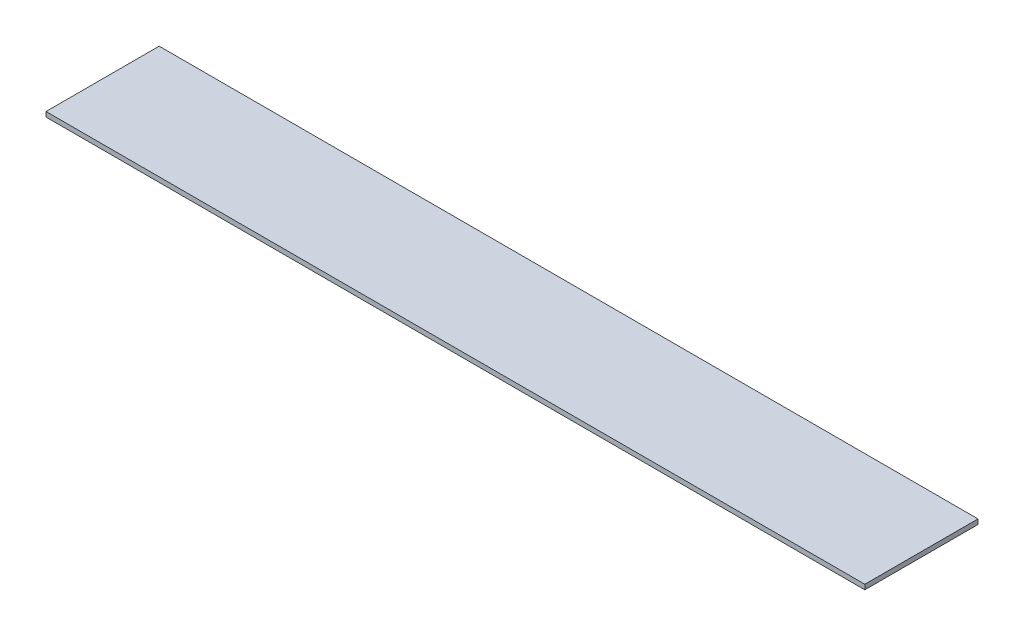
ISO-10303-21;
HEADER;
FILE_DESCRIPTION(('STEP AP214'),'2;1');
FILE_NAME('part.step','',(''),(''),'','','');
FILE_SCHEMA(('AUTOMOTIVE_DESIGN { 1 0 10303 214 1 1 1 1 }'));
ENDSEC;
DATA;
#1=APPLICATION_CONTEXT('core data for automotive mechanical design processes');
#2=APPLICATION_PROTOCOL_DEFINITION('international standard','automotive_design',2000,#1);
#3=PRODUCT_CONTEXT('',#1,'mechanical');
#4=PRODUCT('Part','Part','',(#3));
#5=PRODUCT_RELATED_PRODUCT_CATEGORY('part','',(#4));
#6=PRODUCT_DEFINITION_FORMATION('','',#4);
#7=PRODUCT_DEFINITION_CONTEXT('part definition',#1,'design');
#8=PRODUCT_DEFINITION('design','',#6,#7);
#9=PRODUCT_DEFINITION_SHAPE('','',#8);
#10=(LENGTH_UNIT() NAMED_UNIT(*) SI_UNIT(.MILLI.,.METRE.));
#11=(NAMED_UNIT(*) PLANE_ANGLE_UNIT() SI_UNIT($,.RADIAN.));
#12=(NAMED_UNIT(*) SI_UNIT($,.STERADIAN.) SOLID_ANGLE_UNIT());
#13=UNCERTAINTY_MEASURE_WITH_UNIT(LENGTH_MEASURE(1.E-05),#10,'distance_accuracy_value','');
#14=(GEOMETRIC_REPRESENTATION_CONTEXT(3) GLOBAL_UNCERTAINTY_ASSIGNED_CONTEXT((#13)) GLOBAL_UNIT_ASSIGNED_CONTEXT((#10,
#11,#12)) REPRESENTATION_CONTEXT('',''));
#15=CARTESIAN_POINT('',(0.,0.,0.));
#16=DIRECTION('',(0.,0.,1.));
#17=DIRECTION('',(1.,0.,0.));
#18=AXIS2_PLACEMENT_3D('',#15,#16,#17);
#19=CARTESIAN_POINT('',(-253.25,3.,35.));
#20=DIRECTION('',(1.,0.,0.));
#21=DIRECTION('',(0.,0.,-1.));
#22=AXIS2_PLACEMENT_3D('',#19,#20,#21);
#23=PLANE('',#22);
#24=DIRECTION('',(0.,0.,1.));
#25=VECTOR('',#24,1.);
#26=CARTESIAN_POINT('',(-253.25,0.,35.));
#27=LINE('',#26,#25);
#28=CARTESIAN_POINT('',(-253.25,0.,-35.));
#29=VERTEX_POINT('',#28);
#30=CARTESIAN_POINT('',(-253.25,0.,35.));
#31=VERTEX_POINT('',#30);
#32=EDGE_CURVE('E94',#29,#31,#27,.T.);
#33=ORIENTED_EDGE('',*,*,#32,.T.);
#34=DIRECTION('',(0.,-1.,0.));
#35=VECTOR('',#34,1.);
#36=CARTESIAN_POINT('',(-253.25,3.,35.));
#37=LINE('',#36,#35);
#38=CARTESIAN_POINT('',(-253.25,3.,35.));
#39=VERTEX_POINT('',#38);
#40=EDGE_CURVE('E11',#39,#31,#37,.T.);
#41=ORIENTED_EDGE('',*,*,#40,.F.);
#42=DIRECTION('',(0.,0.,1.));
#43=VECTOR('',#42,1.);
#44=CARTESIAN_POINT('',(-253.25,3.,35.));
#45=LINE('',#44,#43);
#46=CARTESIAN_POINT('',(-253.25,3.,-35.));
#47=VERTEX_POINT('',#46);
#48=EDGE_CURVE('E82',#47,#39,#45,.T.);
#49=ORIENTED_EDGE('',*,*,#48,.F.);
#50=DIRECTION('',(0.,-1.,0.));
#51=VECTOR('',#50,1.);
#52=CARTESIAN_POINT('',(-253.25,3.,-35.));
#53=LINE('',#52,#51);
#54=EDGE_CURVE('E90',#47,#29,#53,.T.);
#55=ORIENTED_EDGE('',*,*,#54,.T.);
#56=EDGE_LOOP('',(#33,#41,#49,#55));
#57=FACE_BOUND('',#56,.T.);
#58=ADVANCED_FACE('F31',(#57),#23,.F.);
#59=CARTESIAN_POINT('',(253.25,3.,35.));
#60=DIRECTION('',(0.,0.,-1.));
#61=DIRECTION('',(-1.,0.,0.));
#62=AXIS2_PLACEMENT_3D('',#59,#60,#61);
#63=PLANE('',#62);
#64=DIRECTION('',(1.,0.,0.));
#65=VECTOR('',#64,1.);
#66=CARTESIAN_POINT('',(253.25,0.,35.));
#67=LINE('',#66,#65);
#68=CARTESIAN_POINT('',(253.25,0.,35.));
#69=VERTEX_POINT('',#68);
#70=EDGE_CURVE('E86',#31,#69,#67,.T.);
#71=ORIENTED_EDGE('',*,*,#70,.T.);
#72=DIRECTION('',(0.,-1.,0.));
#73=VECTOR('',#72,1.);
#74=CARTESIAN_POINT('',(253.25,3.,35.));
#75=LINE('',#74,#73);
#76=CARTESIAN_POINT('',(253.25,3.,35.));
#77=VERTEX_POINT('',#76);
#78=EDGE_CURVE('E39',#77,#69,#75,.T.);
#79=ORIENTED_EDGE('',*,*,#78,.F.);
#80=DIRECTION('',(1.,0.,0.));
#81=VECTOR('',#80,1.);
#82=CARTESIAN_POINT('',(253.25,3.,35.));
#83=LINE('',#82,#81);
#84=EDGE_CURVE('E77',#39,#77,#83,.T.);
#85=ORIENTED_EDGE('',*,*,#84,.F.);
#86=ORIENTED_EDGE('',*,*,#40,.T.);
#87=EDGE_LOOP('',(#71,#79,#85,#86));
#88=FACE_BOUND('',#87,.T.);
#89=ADVANCED_FACE('F85',(#88),#63,.F.);
#90=CARTESIAN_POINT('',(253.25,3.,35.));
#91=DIRECTION('',(-1.,0.,0.));
#92=DIRECTION('',(0.,0.,1.));
#93=AXIS2_PLACEMENT_3D('',#90,#91,#92);
#94=PLANE('',#93);
#95=DIRECTION('',(0.,0.,-1.));
#96=VECTOR('',#95,1.);
#97=CARTESIAN_POINT('',(253.25,0.,35.));
#98=LINE('',#97,#96);
#99=CARTESIAN_POINT('',(253.25,0.,-35.));
#100=VERTEX_POINT('',#99);
#101=EDGE_CURVE('E64',#69,#100,#98,.T.);
#102=ORIENTED_EDGE('',*,*,#101,.T.);
#103=DIRECTION('',(0.,-1.,0.));
#104=VECTOR('',#103,1.);
#105=CARTESIAN_POINT('',(253.25,3.,-35.));
#106=LINE('',#105,#104);
#107=CARTESIAN_POINT('',(253.25,3.,-35.));
#108=VERTEX_POINT('',#107);
#109=EDGE_CURVE('E87',#108,#100,#106,.T.);
#110=ORIENTED_EDGE('',*,*,#109,.F.);
#111=DIRECTION('',(0.,0.,-1.));
#112=VECTOR('',#111,1.);
#113=CARTESIAN_POINT('',(253.25,3.,35.));
#114=LINE('',#113,#112);
#115=EDGE_CURVE('E80',#77,#108,#114,.T.);
#116=ORIENTED_EDGE('',*,*,#115,.F.);
#117=ORIENTED_EDGE('',*,*,#78,.T.);
#118=EDGE_LOOP('',(#102,#110,#116,#117));
#119=FACE_BOUND('',#118,.T.);
#120=ADVANCED_FACE('F88',(#119),#94,.F.);
#121=CARTESIAN_POINT('',(253.25,3.,-35.));
#122=DIRECTION('',(0.,0.,1.));
#123=DIRECTION('',(1.,0.,0.));
#124=AXIS2_PLACEMENT_3D('',#121,#122,#123);
#125=PLANE('',#124);
#126=DIRECTION('',(-1.,0.,0.));
#127=VECTOR('',#126,1.);
#128=CARTESIAN_POINT('',(253.25,0.,-35.));
#129=LINE('',#128,#127);
#130=EDGE_CURVE('E70',#100,#29,#129,.T.);
#131=ORIENTED_EDGE('',*,*,#130,.T.);
#132=ORIENTED_EDGE('',*,*,#54,.F.);
#133=DIRECTION('',(-1.,0.,0.));
#134=VECTOR('',#133,1.);
#135=CARTESIAN_POINT('',(253.25,3.,-35.));
#136=LINE('',#135,#134);
#137=EDGE_CURVE('E47',#108,#47,#136,.T.);
#138=ORIENTED_EDGE('',*,*,#137,.F.);
#139=ORIENTED_EDGE('',*,*,#109,.T.);
#140=EDGE_LOOP('',(#131,#132,#138,#139));
#141=FACE_BOUND('',#140,.T.);
#142=ADVANCED_FACE('F101',(#141),#125,.F.);
#143=CARTESIAN_POINT('',(-253.25,3.,-35.));
#144=DIRECTION('',(0.,1.,0.));
#145=DIRECTION('',(0.,0.,1.));
#146=AXIS2_PLACEMENT_3D('',#143,#144,#145);
#147=PLANE('',#146);
#148=ORIENTED_EDGE('',*,*,#48,.T.);
#149=ORIENTED_EDGE('',*,*,#84,.T.);
#150=ORIENTED_EDGE('',*,*,#115,.T.);
#151=ORIENTED_EDGE('',*,*,#137,.T.);
#152=EDGE_LOOP('',(#148,#149,#150,#151));
#153=FACE_BOUND('',#152,.T.);
#154=ADVANCED_FACE('F78',(#153),#147,.T.);
#155=CARTESIAN_POINT('',(-253.25,0.,-35.));
#156=DIRECTION('',(0.,1.,0.));
#157=DIRECTION('',(0.,0.,1.));
#158=AXIS2_PLACEMENT_3D('',#155,#156,#157);
#159=PLANE('',#158);
#160=ORIENTED_EDGE('',*,*,#32,.F.);
#161=ORIENTED_EDGE('',*,*,#130,.F.);
#162=ORIENTED_EDGE('',*,*,#101,.F.);
#163=ORIENTED_EDGE('',*,*,#70,.F.);
#164=EDGE_LOOP('',(#160,#161,#162,#163));
#165=FACE_BOUND('',#164,.T.);
#166=ADVANCED_FACE('F104',(#165),#159,.F.);
#167=CLOSED_SHELL('',(#58,#89,#120,#142,#154,#166));
#168=MANIFOLD_SOLID_BREP('B2',#167);
#169=ADVANCED_BREP_SHAPE_REPRESENTATION('',(#18,#168),#14);
#170=SHAPE_DEFINITION_REPRESENTATION(#9,#169);
ENDSEC;
END-ISO-10303-21;
